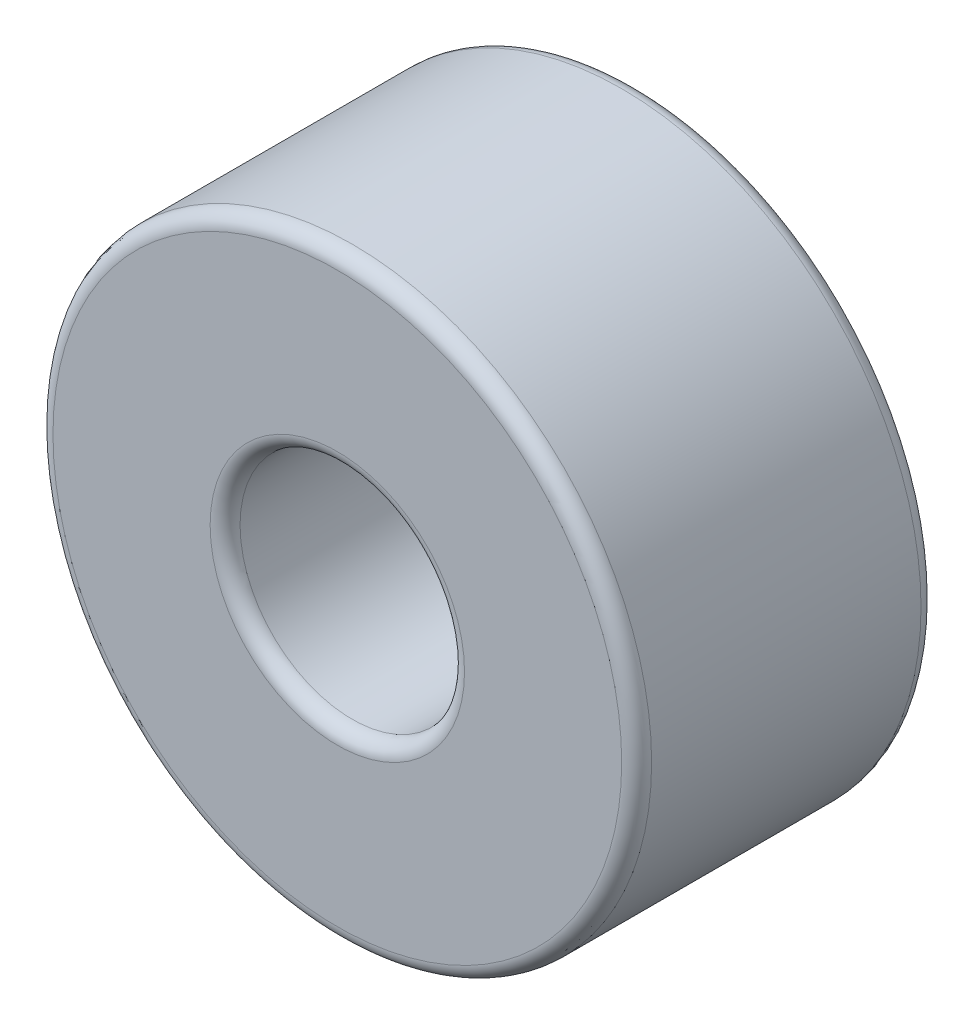
ISO-10303-21;
HEADER;
FILE_DESCRIPTION(('STEP AP214'),'2;1');
FILE_NAME('part.step','',(''),(''),'','','');
FILE_SCHEMA(('AUTOMOTIVE_DESIGN { 1 0 10303 214 1 1 1 1 }'));
ENDSEC;
DATA;
#1=APPLICATION_CONTEXT('core data for automotive mechanical design processes');
#2=APPLICATION_PROTOCOL_DEFINITION('international standard','automotive_design',2000,#1);
#3=PRODUCT_CONTEXT('',#1,'mechanical');
#4=PRODUCT('Part','Part','',(#3));
#5=PRODUCT_RELATED_PRODUCT_CATEGORY('part','',(#4));
#6=PRODUCT_DEFINITION_FORMATION('','',#4);
#7=PRODUCT_DEFINITION_CONTEXT('part definition',#1,'design');
#8=PRODUCT_DEFINITION('design','',#6,#7);
#9=PRODUCT_DEFINITION_SHAPE('','',#8);
#10=(LENGTH_UNIT() NAMED_UNIT(*) SI_UNIT(.MILLI.,.METRE.));
#11=(NAMED_UNIT(*) PLANE_ANGLE_UNIT() SI_UNIT($,.RADIAN.));
#12=(NAMED_UNIT(*) SI_UNIT($,.STERADIAN.) SOLID_ANGLE_UNIT());
#13=UNCERTAINTY_MEASURE_WITH_UNIT(LENGTH_MEASURE(1.E-05),#10,'distance_accuracy_value','');
#14=(GEOMETRIC_REPRESENTATION_CONTEXT(3) GLOBAL_UNCERTAINTY_ASSIGNED_CONTEXT((#13)) GLOBAL_UNIT_ASSIGNED_CONTEXT((#10,
#11,#12)) REPRESENTATION_CONTEXT('',''));
#15=CARTESIAN_POINT('',(0.,0.,0.));
#16=DIRECTION('',(0.,0.,1.));
#17=DIRECTION('',(1.,0.,0.));
#18=AXIS2_PLACEMENT_3D('',#15,#16,#17);
#19=CARTESIAN_POINT('',(0.,0.,4.));
#20=DIRECTION('',(0.,0.,1.));
#21=DIRECTION('',(1.,0.,0.));
#22=AXIS2_PLACEMENT_3D('',#19,#20,#21);
#23=PLANE('',#22);
#24=CARTESIAN_POINT('',(0.,0.,4.));
#25=DIRECTION('',(0.,0.,1.));
#26=DIRECTION('',(1.,0.,0.));
#27=AXIS2_PLACEMENT_3D('',#24,#25,#26);
#28=CIRCLE('',#27,1.7);
#29=CARTESIAN_POINT('',(1.7,0.,4.));
#30=VERTEX_POINT('',#29);
#31=EDGE_CURVE('E49',#30,#30,#28,.F.);
#32=ORIENTED_EDGE('',*,*,#31,.T.);
#33=EDGE_LOOP('',(#32));
#34=FACE_BOUND('',#33,.T.);
#35=CARTESIAN_POINT('',(0.,0.,4.));
#36=DIRECTION('',(0.,0.,1.));
#37=DIRECTION('',(1.,0.,0.));
#38=AXIS2_PLACEMENT_3D('',#35,#36,#37);
#39=CIRCLE('',#38,3.8);
#40=CARTESIAN_POINT('',(3.8,0.,4.));
#41=VERTEX_POINT('',#40);
#42=EDGE_CURVE('E53',#41,#41,#39,.T.);
#43=ORIENTED_EDGE('',*,*,#42,.T.);
#44=EDGE_LOOP('',(#43));
#45=FACE_BOUND('',#44,.T.);
#46=ADVANCED_FACE('F38',(#34,#45),#23,.T.);
#47=CARTESIAN_POINT('',(0.,0.,0.));
#48=DIRECTION('',(0.,0.,1.));
#49=DIRECTION('',(1.,0.,0.));
#50=AXIS2_PLACEMENT_3D('',#47,#48,#49);
#51=PLANE('',#50);
#52=CARTESIAN_POINT('',(0.,0.,0.));
#53=DIRECTION('',(0.,0.,1.));
#54=DIRECTION('',(1.,0.,0.));
#55=AXIS2_PLACEMENT_3D('',#52,#53,#54);
#56=CIRCLE('',#55,1.7);
#57=CARTESIAN_POINT('',(1.7,0.,0.));
#58=VERTEX_POINT('',#57);
#59=EDGE_CURVE('E64',#58,#58,#56,.T.);
#60=ORIENTED_EDGE('',*,*,#59,.T.);
#61=EDGE_LOOP('',(#60));
#62=FACE_BOUND('',#61,.T.);
#63=CARTESIAN_POINT('',(0.,0.,0.));
#64=DIRECTION('',(0.,0.,1.));
#65=DIRECTION('',(1.,0.,0.));
#66=AXIS2_PLACEMENT_3D('',#63,#64,#65);
#67=CIRCLE('',#66,3.8);
#68=CARTESIAN_POINT('',(3.8,0.,0.));
#69=VERTEX_POINT('',#68);
#70=EDGE_CURVE('E67',#69,#69,#67,.F.);
#71=ORIENTED_EDGE('',*,*,#70,.T.);
#72=EDGE_LOOP('',(#71));
#73=FACE_BOUND('',#72,.T.);
#74=ADVANCED_FACE('F71',(#62,#73),#51,.F.);
#75=CARTESIAN_POINT('',(0.,0.,4.));
#76=DIRECTION('',(0.,0.,-1.));
#77=DIRECTION('',(-1.,0.,0.));
#78=AXIS2_PLACEMENT_3D('',#75,#76,#77);
#79=CYLINDRICAL_SURFACE('',#78,4.);
#80=CARTESIAN_POINT('',(0.,0.,0.2));
#81=DIRECTION('',(0.,0.,1.));
#82=DIRECTION('',(1.,0.,0.));
#83=AXIS2_PLACEMENT_3D('',#80,#81,#82);
#84=CIRCLE('',#83,4.);
#85=CARTESIAN_POINT('',(4.,0.,0.2));
#86=VERTEX_POINT('',#85);
#87=EDGE_CURVE('E11',#86,#86,#84,.T.);
#88=ORIENTED_EDGE('',*,*,#87,.T.);
#89=EDGE_LOOP('',(#88));
#90=FACE_BOUND('',#89,.T.);
#91=CARTESIAN_POINT('',(0.,0.,3.8));
#92=DIRECTION('',(0.,0.,1.));
#93=DIRECTION('',(1.,0.,0.));
#94=AXIS2_PLACEMENT_3D('',#91,#92,#93);
#95=CIRCLE('',#94,4.);
#96=CARTESIAN_POINT('',(4.,0.,3.8));
#97=VERTEX_POINT('',#96);
#98=EDGE_CURVE('E45',#97,#97,#95,.F.);
#99=ORIENTED_EDGE('',*,*,#98,.T.);
#100=EDGE_LOOP('',(#99));
#101=FACE_BOUND('',#100,.T.);
#102=ADVANCED_FACE('F91',(#90,#101),#79,.T.);
#103=CARTESIAN_POINT('',(0.,0.,4.));
#104=DIRECTION('',(0.,0.,-1.));
#105=DIRECTION('',(-1.,0.,0.));
#106=AXIS2_PLACEMENT_3D('',#103,#104,#105);
#107=CYLINDRICAL_SURFACE('',#106,1.5);
#108=CARTESIAN_POINT('',(0.,0.,0.2));
#109=DIRECTION('',(0.,0.,1.));
#110=DIRECTION('',(1.,0.,0.));
#111=AXIS2_PLACEMENT_3D('',#108,#109,#110);
#112=CIRCLE('',#111,1.5);
#113=CARTESIAN_POINT('',(1.5,0.,0.2));
#114=VERTEX_POINT('',#113);
#115=EDGE_CURVE('E58',#114,#114,#112,.F.);
#116=ORIENTED_EDGE('',*,*,#115,.T.);
#117=EDGE_LOOP('',(#116));
#118=FACE_BOUND('',#117,.T.);
#119=CARTESIAN_POINT('',(0.,0.,3.8));
#120=DIRECTION('',(0.,0.,1.));
#121=DIRECTION('',(1.,0.,0.));
#122=AXIS2_PLACEMENT_3D('',#119,#120,#121);
#123=CIRCLE('',#122,1.5);
#124=CARTESIAN_POINT('',(1.5,0.,3.8));
#125=VERTEX_POINT('',#124);
#126=EDGE_CURVE('E61',#125,#125,#123,.T.);
#127=ORIENTED_EDGE('',*,*,#126,.T.);
#128=EDGE_LOOP('',(#127));
#129=FACE_BOUND('',#128,.T.);
#130=ADVANCED_FACE('F96',(#118,#129),#107,.F.);
#131=CARTESIAN_POINT('',(0.,0.,0.2));
#132=DIRECTION('',(0.,0.,1.));
#133=DIRECTION('',(1.,0.,0.));
#134=AXIS2_PLACEMENT_3D('',#131,#132,#133);
#135=TOROIDAL_SURFACE('',#134,1.7,0.2);
#136=ORIENTED_EDGE('',*,*,#115,.F.);
#137=EDGE_LOOP('',(#136));
#138=FACE_BOUND('',#137,.T.);
#139=ORIENTED_EDGE('',*,*,#59,.F.);
#140=EDGE_LOOP('',(#139));
#141=FACE_BOUND('',#140,.T.);
#142=ADVANCED_FACE('F82',(#138,#141),#135,.T.);
#143=CARTESIAN_POINT('',(0.,0.,3.8));
#144=DIRECTION('',(0.,0.,1.));
#145=DIRECTION('',(1.,0.,0.));
#146=AXIS2_PLACEMENT_3D('',#143,#144,#145);
#147=TOROIDAL_SURFACE('',#146,1.7,0.2);
#148=ORIENTED_EDGE('',*,*,#31,.F.);
#149=EDGE_LOOP('',(#148));
#150=FACE_BOUND('',#149,.T.);
#151=ORIENTED_EDGE('',*,*,#126,.F.);
#152=EDGE_LOOP('',(#151));
#153=FACE_BOUND('',#152,.T.);
#154=ADVANCED_FACE('F76',(#150,#153),#147,.T.);
#155=CARTESIAN_POINT('',(0.,0.,0.2));
#156=DIRECTION('',(0.,0.,1.));
#157=DIRECTION('',(1.,0.,0.));
#158=AXIS2_PLACEMENT_3D('',#155,#156,#157);
#159=TOROIDAL_SURFACE('',#158,3.8,0.2);
#160=ORIENTED_EDGE('',*,*,#70,.F.);
#161=EDGE_LOOP('',(#160));
#162=FACE_BOUND('',#161,.T.);
#163=ORIENTED_EDGE('',*,*,#87,.F.);
#164=EDGE_LOOP('',(#163));
#165=FACE_BOUND('',#164,.T.);
#166=ADVANCED_FACE('F73',(#162,#165),#159,.T.);
#167=CARTESIAN_POINT('',(0.,0.,3.8));
#168=DIRECTION('',(0.,0.,1.));
#169=DIRECTION('',(1.,0.,0.));
#170=AXIS2_PLACEMENT_3D('',#167,#168,#169);
#171=TOROIDAL_SURFACE('',#170,3.8,0.2);
#172=ORIENTED_EDGE('',*,*,#98,.F.);
#173=EDGE_LOOP('',(#172));
#174=FACE_BOUND('',#173,.T.);
#175=ORIENTED_EDGE('',*,*,#42,.F.);
#176=EDGE_LOOP('',(#175));
#177=FACE_BOUND('',#176,.T.);
#178=ADVANCED_FACE('F40',(#174,#177),#171,.T.);
#179=CLOSED_SHELL('',(#46,#74,#102,#130,#142,#154,#166,#178));
#180=MANIFOLD_SOLID_BREP('B2',#179);
#181=ADVANCED_BREP_SHAPE_REPRESENTATION('',(#18,#180),#14);
#182=SHAPE_DEFINITION_REPRESENTATION(#9,#181);
ENDSEC;
END-ISO-10303-21;
